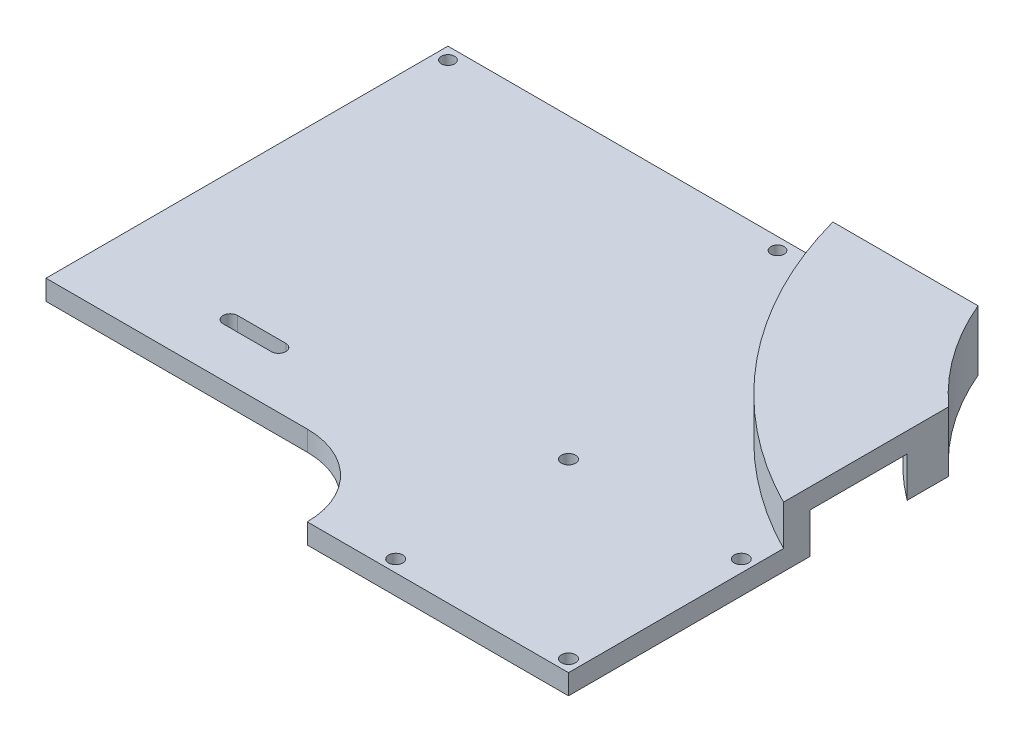
ISO-10303-21;
HEADER;
FILE_DESCRIPTION(('STEP AP214'),'2;1');
FILE_NAME('part.step','',(''),(''),'','','');
FILE_SCHEMA(('AUTOMOTIVE_DESIGN { 1 0 10303 214 1 1 1 1 }'));
ENDSEC;
DATA;
#1=APPLICATION_CONTEXT('core data for automotive mechanical design processes');
#2=APPLICATION_PROTOCOL_DEFINITION('international standard','automotive_design',2000,#1);
#3=PRODUCT_CONTEXT('',#1,'mechanical');
#4=PRODUCT('Part','Part','',(#3));
#5=PRODUCT_RELATED_PRODUCT_CATEGORY('part','',(#4));
#6=PRODUCT_DEFINITION_FORMATION('','',#4);
#7=PRODUCT_DEFINITION_CONTEXT('part definition',#1,'design');
#8=PRODUCT_DEFINITION('design','',#6,#7);
#9=PRODUCT_DEFINITION_SHAPE('','',#8);
#10=(LENGTH_UNIT() NAMED_UNIT(*) SI_UNIT(.MILLI.,.METRE.));
#11=(NAMED_UNIT(*) PLANE_ANGLE_UNIT() SI_UNIT($,.RADIAN.));
#12=(NAMED_UNIT(*) SI_UNIT($,.STERADIAN.) SOLID_ANGLE_UNIT());
#13=UNCERTAINTY_MEASURE_WITH_UNIT(LENGTH_MEASURE(1.E-05),#10,'distance_accuracy_value','');
#14=(GEOMETRIC_REPRESENTATION_CONTEXT(3) GLOBAL_UNCERTAINTY_ASSIGNED_CONTEXT((#13)) GLOBAL_UNIT_ASSIGNED_CONTEXT((#10,
#11,#12)) REPRESENTATION_CONTEXT('',''));
#15=CARTESIAN_POINT('',(0.,0.,0.));
#16=DIRECTION('',(0.,0.,1.));
#17=DIRECTION('',(1.,0.,0.));
#18=AXIS2_PLACEMENT_3D('',#15,#16,#17);
#19=CARTESIAN_POINT('',(0.,0.,0.));
#20=DIRECTION('',(0.,-1.,0.));
#21=DIRECTION('',(0.,0.,-1.));
#22=AXIS2_PLACEMENT_3D('',#19,#20,#21);
#23=PLANE('',#22);
#24=CARTESIAN_POINT('',(123.,0.,-88.));
#25=DIRECTION('',(0.,-1.,0.));
#26=DIRECTION('',(0.,0.,-1.));
#27=AXIS2_PLACEMENT_3D('',#24,#25,#26);
#28=CIRCLE('',#27,71.8);
#29=CARTESIAN_POINT('',(75.,0.,-34.6029963387458));
#30=VERTEX_POINT('',#29);
#31=CARTESIAN_POINT('',(56.8846462612504,0.,-60.));
#32=VERTEX_POINT('',#31);
#33=EDGE_CURVE('E198',#30,#32,#28,.T.);
#34=ORIENTED_EDGE('',*,*,#33,.F.);
#35=DIRECTION('',(0.,0.,-1.));
#36=VECTOR('',#35,1.);
#37=CARTESIAN_POINT('',(75.,0.,60.));
#38=LINE('',#37,#36);
#39=CARTESIAN_POINT('',(75.,0.,-24.2501764708325));
#40=VERTEX_POINT('',#39);
#41=EDGE_CURVE('E250',#40,#30,#38,.T.);
#42=ORIENTED_EDGE('',*,*,#41,.F.);
#43=CARTESIAN_POINT('',(123.,0.,-88.));
#44=DIRECTION('',(0.,-1.,0.));
#45=DIRECTION('',(0.,0.,1.));
#46=AXIS2_PLACEMENT_3D('',#43,#44,#45);
#47=CIRCLE('',#46,79.8);
#48=CARTESIAN_POINT('',(48.2735655875379,0.,-60.));
#49=VERTEX_POINT('',#48);
#50=EDGE_CURVE('E204',#40,#49,#47,.T.);
#51=ORIENTED_EDGE('',*,*,#50,.T.);
#52=DIRECTION('',(-1.,0.,0.));
#53=VECTOR('',#52,1.);
#54=CARTESIAN_POINT('',(-75.,0.,-60.));
#55=LINE('',#54,#53);
#56=EDGE_CURVE('E329',#32,#49,#55,.T.);
#57=ORIENTED_EDGE('',*,*,#56,.F.);
#58=EDGE_LOOP('',(#34,#42,#51,#57));
#59=FACE_BOUND('',#58,.T.);
#60=ADVANCED_FACE('F57',(#59),#23,.T.);
#61=CARTESIAN_POINT('',(75.,5.,60.));
#62=DIRECTION('',(-1.,0.,0.));
#63=DIRECTION('',(0.,0.,1.));
#64=AXIS2_PLACEMENT_3D('',#61,#62,#63);
#65=PLANE('',#64);
#66=ORIENTED_EDGE('',*,*,#41,.T.);
#67=DIRECTION('',(0.,-1.,0.));
#68=VECTOR('',#67,1.);
#69=CARTESIAN_POINT('',(75.,20.,-34.6029963387458));
#70=LINE('',#69,#68);
#71=CARTESIAN_POINT('',(75.,15.,-34.6029963387458));
#72=VERTEX_POINT('',#71);
#73=EDGE_CURVE('E201',#30,#72,#70,.F.);
#74=ORIENTED_EDGE('',*,*,#73,.T.);
#75=DIRECTION('',(0.,0.,-1.));
#76=VECTOR('',#75,1.);
#77=CARTESIAN_POINT('',(75.,15.,-60.));
#78=LINE('',#77,#76);
#79=CARTESIAN_POINT('',(75.,15.,6.50925880568526));
#80=VERTEX_POINT('',#79);
#81=EDGE_CURVE('E214',#80,#72,#78,.T.);
#82=ORIENTED_EDGE('',*,*,#81,.F.);
#83=DIRECTION('',(0.,-1.,0.));
#84=VECTOR('',#83,1.);
#85=CARTESIAN_POINT('',(75.,10.,6.50925880568526));
#86=LINE('',#85,#84);
#87=CARTESIAN_POINT('',(75.,5.,6.50925880568526));
#88=VERTEX_POINT('',#87);
#89=EDGE_CURVE('E233',#80,#88,#86,.T.);
#90=ORIENTED_EDGE('',*,*,#89,.T.);
#91=DIRECTION('',(0.,0.,-1.));
#92=VECTOR('',#91,1.);
#93=CARTESIAN_POINT('',(75.,5.,60.));
#94=LINE('',#93,#92);
#95=CARTESIAN_POINT('',(75.,5.,60.));
#96=VERTEX_POINT('',#95);
#97=EDGE_CURVE('E315',#96,#88,#94,.T.);
#98=ORIENTED_EDGE('',*,*,#97,.F.);
#99=DIRECTION('',(0.,-1.,0.));
#100=VECTOR('',#99,1.);
#101=CARTESIAN_POINT('',(75.,5.,60.));
#102=LINE('',#101,#100);
#103=CARTESIAN_POINT('',(75.,0.,60.));
#104=VERTEX_POINT('',#103);
#105=EDGE_CURVE('E324',#96,#104,#102,.T.);
#106=ORIENTED_EDGE('',*,*,#105,.T.);
#107=CARTESIAN_POINT('',(74.9999999999999,0.,-0.0452389008986226));
#108=VERTEX_POINT('',#107);
#109=EDGE_CURVE('E325',#104,#108,#38,.T.);
#110=ORIENTED_EDGE('',*,*,#109,.T.);
#111=DIRECTION('',(0.,-1.,0.));
#112=VECTOR('',#111,1.);
#113=CARTESIAN_POINT('',(75.,10.,-0.0452389008985948));
#114=LINE('',#113,#112);
#115=CARTESIAN_POINT('',(75.,10.,-0.0452389008985948));
#116=VERTEX_POINT('',#115);
#117=EDGE_CURVE('E231',#116,#108,#114,.T.);
#118=ORIENTED_EDGE('',*,*,#117,.F.);
#119=DIRECTION('',(0.,0.,-1.));
#120=VECTOR('',#119,1.);
#121=CARTESIAN_POINT('',(75.,10.,-60.));
#122=LINE('',#121,#120);
#123=CARTESIAN_POINT('',(75.,10.,-24.2501764708325));
#124=VERTEX_POINT('',#123);
#125=EDGE_CURVE('E210',#116,#124,#122,.T.);
#126=ORIENTED_EDGE('',*,*,#125,.T.);
#127=DIRECTION('',(0.,-1.,0.));
#128=VECTOR('',#127,1.);
#129=CARTESIAN_POINT('',(75.,10.,-24.2501764708325));
#130=LINE('',#129,#128);
#131=EDGE_CURVE('E241',#124,#40,#130,.T.);
#132=ORIENTED_EDGE('',*,*,#131,.T.);
#133=EDGE_LOOP('',(#66,#74,#82,#90,#98,#106,#110,#118,#126,#132));
#134=FACE_BOUND('',#133,.T.);
#135=ADVANCED_FACE('F59',(#134),#65,.F.);
#136=CARTESIAN_POINT('',(-75.,5.,-60.));
#137=DIRECTION('',(0.,0.,1.));
#138=DIRECTION('',(1.,0.,0.));
#139=AXIS2_PLACEMENT_3D('',#136,#137,#138);
#140=PLANE('',#139);
#141=DIRECTION('',(-1.,0.,0.));
#142=VECTOR('',#141,1.);
#143=CARTESIAN_POINT('',(20.7649766469436,15.,-60.));
#144=LINE('',#143,#142);
#145=CARTESIAN_POINT('',(56.8846462612504,15.,-60.));
#146=VERTEX_POINT('',#145);
#147=CARTESIAN_POINT('',(20.7649766469436,15.,-60.));
#148=VERTEX_POINT('',#147);
#149=EDGE_CURVE('E218',#146,#148,#144,.T.);
#150=ORIENTED_EDGE('',*,*,#149,.F.);
#151=DIRECTION('',(0.,-1.,0.));
#152=VECTOR('',#151,1.);
#153=CARTESIAN_POINT('',(56.8846462612504,20.,-60.));
#154=LINE('',#153,#152);
#155=EDGE_CURVE('E79',#146,#32,#154,.T.);
#156=ORIENTED_EDGE('',*,*,#155,.T.);
#157=ORIENTED_EDGE('',*,*,#56,.T.);
#158=DIRECTION('',(0.,-1.,0.));
#159=VECTOR('',#158,1.);
#160=CARTESIAN_POINT('',(48.2735655875379,10.,-60.));
#161=LINE('',#160,#159);
#162=CARTESIAN_POINT('',(48.2735655875379,10.,-60.));
#163=VERTEX_POINT('',#162);
#164=EDGE_CURVE('E243',#163,#49,#161,.T.);
#165=ORIENTED_EDGE('',*,*,#164,.F.);
#166=DIRECTION('',(-1.,0.,0.));
#167=VECTOR('',#166,1.);
#168=CARTESIAN_POINT('',(20.7649766469436,10.,-60.));
#169=LINE('',#168,#167);
#170=CARTESIAN_POINT('',(26.7916843510916,10.,-60.));
#171=VERTEX_POINT('',#170);
#172=EDGE_CURVE('E215',#163,#171,#169,.T.);
#173=ORIENTED_EDGE('',*,*,#172,.T.);
#174=DIRECTION('',(0.,-1.,0.));
#175=VECTOR('',#174,1.);
#176=CARTESIAN_POINT('',(26.7916843510916,10.,-60.));
#177=LINE('',#176,#175);
#178=CARTESIAN_POINT('',(26.7916843510916,0.,-60.));
#179=VERTEX_POINT('',#178);
#180=EDGE_CURVE('E228',#171,#179,#177,.T.);
#181=ORIENTED_EDGE('',*,*,#180,.T.);
#182=CARTESIAN_POINT('',(-75.,0.,-60.));
#183=VERTEX_POINT('',#182);
#184=EDGE_CURVE('E328',#179,#183,#55,.T.);
#185=ORIENTED_EDGE('',*,*,#184,.T.);
#186=DIRECTION('',(0.,-1.,0.));
#187=VECTOR('',#186,1.);
#188=CARTESIAN_POINT('',(-75.,5.,-60.));
#189=LINE('',#188,#187);
#190=CARTESIAN_POINT('',(-75.,5.,-60.));
#191=VERTEX_POINT('',#190);
#192=EDGE_CURVE('E337',#191,#183,#189,.T.);
#193=ORIENTED_EDGE('',*,*,#192,.F.);
#194=DIRECTION('',(-1.,0.,0.));
#195=VECTOR('',#194,1.);
#196=CARTESIAN_POINT('',(-75.,5.,-60.));
#197=LINE('',#196,#195);
#198=CARTESIAN_POINT('',(20.7649766469436,5.,-60.));
#199=VERTEX_POINT('',#198);
#200=EDGE_CURVE('E318',#199,#191,#197,.T.);
#201=ORIENTED_EDGE('',*,*,#200,.F.);
#202=DIRECTION('',(0.,-1.,0.));
#203=VECTOR('',#202,1.);
#204=CARTESIAN_POINT('',(20.7649766469436,10.,-60.));
#205=LINE('',#204,#203);
#206=EDGE_CURVE('E236',#148,#199,#205,.T.);
#207=ORIENTED_EDGE('',*,*,#206,.F.);
#208=EDGE_LOOP('',(#150,#156,#157,#165,#173,#181,#185,#193,#201,#207));
#209=FACE_BOUND('',#208,.T.);
#210=ADVANCED_FACE('F362',(#209),#140,.F.);
#211=CARTESIAN_POINT('',(-75.,5.,60.));
#212=DIRECTION('',(1.,0.,0.));
#213=DIRECTION('',(0.,0.,-1.));
#214=AXIS2_PLACEMENT_3D('',#211,#212,#213);
#215=PLANE('',#214);
#216=DIRECTION('',(0.,0.,1.));
#217=VECTOR('',#216,1.);
#218=CARTESIAN_POINT('',(-75.,0.,60.));
#219=LINE('',#218,#217);
#220=CARTESIAN_POINT('',(-75.,0.,40.));
#221=VERTEX_POINT('',#220);
#222=EDGE_CURVE('E331',#183,#221,#219,.T.);
#223=ORIENTED_EDGE('',*,*,#222,.T.);
#224=DIRECTION('',(0.,1.,0.));
#225=VECTOR('',#224,1.);
#226=CARTESIAN_POINT('',(-75.,-5.,40.));
#227=LINE('',#226,#225);
#228=CARTESIAN_POINT('',(-75.,5.,40.));
#229=VERTEX_POINT('',#228);
#230=EDGE_CURVE('E179',#221,#229,#227,.T.);
#231=ORIENTED_EDGE('',*,*,#230,.T.);
#232=DIRECTION('',(0.,0.,1.));
#233=VECTOR('',#232,1.);
#234=CARTESIAN_POINT('',(-75.,5.,60.));
#235=LINE('',#234,#233);
#236=EDGE_CURVE('E193',#191,#229,#235,.T.);
#237=ORIENTED_EDGE('',*,*,#236,.F.);
#238=ORIENTED_EDGE('',*,*,#192,.T.);
#239=EDGE_LOOP('',(#223,#231,#237,#238));
#240=FACE_BOUND('',#239,.T.);
#241=ADVANCED_FACE('F366',(#240),#215,.F.);
#242=CARTESIAN_POINT('',(-75.,5.,60.));
#243=DIRECTION('',(0.,0.,-1.));
#244=DIRECTION('',(-1.,0.,0.));
#245=AXIS2_PLACEMENT_3D('',#242,#243,#244);
#246=PLANE('',#245);
#247=DIRECTION('',(1.,0.,0.));
#248=VECTOR('',#247,1.);
#249=CARTESIAN_POINT('',(-75.,5.,60.));
#250=LINE('',#249,#248);
#251=CARTESIAN_POINT('',(10.,5.,60.));
#252=VERTEX_POINT('',#251);
#253=EDGE_CURVE('E322',#252,#96,#250,.T.);
#254=ORIENTED_EDGE('',*,*,#253,.F.);
#255=DIRECTION('',(0.,1.,0.));
#256=VECTOR('',#255,1.);
#257=CARTESIAN_POINT('',(10.,-5.,60.));
#258=LINE('',#257,#256);
#259=CARTESIAN_POINT('',(10.,0.,60.));
#260=VERTEX_POINT('',#259);
#261=EDGE_CURVE('E185',#252,#260,#258,.F.);
#262=ORIENTED_EDGE('',*,*,#261,.T.);
#263=DIRECTION('',(1.,0.,0.));
#264=VECTOR('',#263,1.);
#265=CARTESIAN_POINT('',(-75.,0.,60.));
#266=LINE('',#265,#264);
#267=EDGE_CURVE('E319',#260,#104,#266,.T.);
#268=ORIENTED_EDGE('',*,*,#267,.T.);
#269=ORIENTED_EDGE('',*,*,#105,.F.);
#270=EDGE_LOOP('',(#254,#262,#268,#269));
#271=FACE_BOUND('',#270,.T.);
#272=ADVANCED_FACE('F344',(#271),#246,.F.);
#273=CARTESIAN_POINT('',(0.,5.,0.));
#274=DIRECTION('',(0.,-1.,0.));
#275=DIRECTION('',(0.,0.,-1.));
#276=AXIS2_PLACEMENT_3D('',#273,#274,#275);
#277=PLANE('',#276);
#278=ORIENTED_EDGE('',*,*,#236,.T.);
#279=DIRECTION('',(-1.,0.,0.));
#280=VECTOR('',#279,1.);
#281=CARTESIAN_POINT('',(-75.,5.,40.));
#282=LINE('',#281,#280);
#283=CARTESIAN_POINT('',(-9.99999999999999,5.,40.));
#284=VERTEX_POINT('',#283);
#285=EDGE_CURVE('E175',#284,#229,#282,.T.);
#286=ORIENTED_EDGE('',*,*,#285,.F.);
#287=CARTESIAN_POINT('',(-9.99999999999999,5.,60.));
#288=DIRECTION('',(0.,1.,0.));
#289=DIRECTION('',(0.,0.,1.));
#290=AXIS2_PLACEMENT_3D('',#287,#288,#289);
#291=CIRCLE('',#290,20.);
#292=EDGE_CURVE('E182',#252,#284,#291,.T.);
#293=ORIENTED_EDGE('',*,*,#292,.F.);
#294=ORIENTED_EDGE('',*,*,#253,.T.);
#295=ORIENTED_EDGE('',*,*,#97,.T.);
#296=CARTESIAN_POINT('',(123.,5.,-88.));
#297=DIRECTION('',(0.,1.,0.));
#298=DIRECTION('',(0.,0.,1.));
#299=AXIS2_PLACEMENT_3D('',#296,#297,#298);
#300=CIRCLE('',#299,106.);
#301=EDGE_CURVE('E220',#199,#88,#300,.T.);
#302=ORIENTED_EDGE('',*,*,#301,.F.);
#303=ORIENTED_EDGE('',*,*,#200,.T.);
#304=EDGE_LOOP('',(#278,#286,#293,#294,#295,#302,#303));
#305=FACE_BOUND('',#304,.T.);
#306=CARTESIAN_POINT('',(-72.,5.,-57.));
#307=DIRECTION('',(0.,1.,0.));
#308=DIRECTION('',(0.,0.,1.));
#309=AXIS2_PLACEMENT_3D('',#306,#307,#308);
#310=CIRCLE('',#309,1.65);
#311=CARTESIAN_POINT('',(-72.,5.,-55.35));
#312=VERTEX_POINT('',#311);
#313=EDGE_CURVE('E251',#312,#312,#310,.T.);
#314=ORIENTED_EDGE('',*,*,#313,.F.);
#315=EDGE_LOOP('',(#314));
#316=FACE_BOUND('',#315,.T.);
#317=CARTESIAN_POINT('',(29.,5.,14.));
#318=DIRECTION('',(0.,1.,0.));
#319=DIRECTION('',(0.,0.,1.));
#320=AXIS2_PLACEMENT_3D('',#317,#318,#319);
#321=CIRCLE('',#320,1.75);
#322=CARTESIAN_POINT('',(29.,5.,15.75));
#323=VERTEX_POINT('',#322);
#324=EDGE_CURVE('E246',#323,#323,#321,.T.);
#325=ORIENTED_EDGE('',*,*,#324,.F.);
#326=EDGE_LOOP('',(#325));
#327=FACE_BOUND('',#326,.T.);
#328=CARTESIAN_POINT('',(72.,5.,14.));
#329=DIRECTION('',(0.,1.,0.));
#330=DIRECTION('',(0.,0.,1.));
#331=AXIS2_PLACEMENT_3D('',#328,#329,#330);
#332=CIRCLE('',#331,1.75);
#333=CARTESIAN_POINT('',(72.,5.,15.75));
#334=VERTEX_POINT('',#333);
#335=EDGE_CURVE('E259',#334,#334,#332,.T.);
#336=ORIENTED_EDGE('',*,*,#335,.F.);
#337=EDGE_LOOP('',(#336));
#338=FACE_BOUND('',#337,.T.);
#339=CARTESIAN_POINT('',(29.,5.,57.));
#340=DIRECTION('',(0.,1.,0.));
#341=DIRECTION('',(0.,0.,1.));
#342=AXIS2_PLACEMENT_3D('',#339,#340,#341);
#343=CIRCLE('',#342,1.75);
#344=CARTESIAN_POINT('',(29.,5.,58.75));
#345=VERTEX_POINT('',#344);
#346=EDGE_CURVE('E258',#345,#345,#343,.T.);
#347=ORIENTED_EDGE('',*,*,#346,.F.);
#348=EDGE_LOOP('',(#347));
#349=FACE_BOUND('',#348,.T.);
#350=CARTESIAN_POINT('',(72.,5.,57.));
#351=DIRECTION('',(0.,1.,0.));
#352=DIRECTION('',(0.,0.,1.));
#353=AXIS2_PLACEMENT_3D('',#350,#351,#352);
#354=CIRCLE('',#353,1.75);
#355=CARTESIAN_POINT('',(72.,5.,58.75));
#356=VERTEX_POINT('',#355);
#357=EDGE_CURVE('E307',#356,#356,#354,.T.);
#358=ORIENTED_EDGE('',*,*,#357,.F.);
#359=EDGE_LOOP('',(#358));
#360=FACE_BOUND('',#359,.T.);
#361=DIRECTION('',(1.,0.,0.));
#362=VECTOR('',#361,1.);
#363=CARTESIAN_POINT('',(-43.1383514073638,5.,27.8));
#364=LINE('',#363,#362);
#365=CARTESIAN_POINT('',(-43.1383514073638,5.,27.8));
#366=VERTEX_POINT('',#365);
#367=CARTESIAN_POINT('',(-31.1383514073638,5.,27.8));
#368=VERTEX_POINT('',#367);
#369=EDGE_CURVE('E289',#366,#368,#364,.T.);
#370=ORIENTED_EDGE('',*,*,#369,.F.);
#371=CARTESIAN_POINT('',(-43.1383514073638,5.,26.));
#372=DIRECTION('',(0.,1.,0.));
#373=DIRECTION('',(0.,0.,1.));
#374=AXIS2_PLACEMENT_3D('',#371,#372,#373);
#375=CIRCLE('',#374,1.8);
#376=CARTESIAN_POINT('',(-43.1383514073638,5.,24.2));
#377=VERTEX_POINT('',#376);
#378=EDGE_CURVE('E287',#377,#366,#375,.T.);
#379=ORIENTED_EDGE('',*,*,#378,.F.);
#380=DIRECTION('',(-1.,0.,0.));
#381=VECTOR('',#380,1.);
#382=CARTESIAN_POINT('',(-43.1383514073638,5.,24.2));
#383=LINE('',#382,#381);
#384=CARTESIAN_POINT('',(-31.1383514073638,5.,24.2));
#385=VERTEX_POINT('',#384);
#386=EDGE_CURVE('E277',#385,#377,#383,.T.);
#387=ORIENTED_EDGE('',*,*,#386,.F.);
#388=CARTESIAN_POINT('',(-31.1383514073638,5.,26.));
#389=DIRECTION('',(0.,1.,0.));
#390=DIRECTION('',(0.,0.,1.));
#391=AXIS2_PLACEMENT_3D('',#388,#389,#390);
#392=CIRCLE('',#391,1.8);
#393=EDGE_CURVE('E293',#368,#385,#392,.T.);
#394=ORIENTED_EDGE('',*,*,#393,.F.);
#395=EDGE_LOOP('',(#370,#379,#387,#394));
#396=FACE_BOUND('',#395,.T.);
#397=CARTESIAN_POINT('',(10.,5.,-57.));
#398=DIRECTION('',(0.,1.,0.));
#399=DIRECTION('',(0.,0.,1.));
#400=AXIS2_PLACEMENT_3D('',#397,#398,#399);
#401=CIRCLE('',#400,1.65);
#402=CARTESIAN_POINT('',(10.,5.,-55.35));
#403=VERTEX_POINT('',#402);
#404=EDGE_CURVE('E269',#403,#403,#401,.T.);
#405=ORIENTED_EDGE('',*,*,#404,.F.);
#406=EDGE_LOOP('',(#405));
#407=FACE_BOUND('',#406,.T.);
#408=ADVANCED_FACE('F190',(#305,#316,#327,#338,#349,#360,#396,#407),#277,.F.);
#409=DIRECTION('',(1.,0.,0.));
#410=VECTOR('',#409,1.);
#411=CARTESIAN_POINT('',(0.,0.,40.));
#412=LINE('',#411,#410);
#413=CARTESIAN_POINT('',(-9.99999999999999,0.,40.));
#414=VERTEX_POINT('',#413);
#415=EDGE_CURVE('E12',#221,#414,#412,.T.);
#416=ORIENTED_EDGE('',*,*,#415,.F.);
#417=ORIENTED_EDGE('',*,*,#222,.F.);
#418=ORIENTED_EDGE('',*,*,#184,.F.);
#419=CARTESIAN_POINT('',(123.,0.,-88.));
#420=DIRECTION('',(0.,1.,0.));
#421=DIRECTION('',(0.,0.,1.));
#422=AXIS2_PLACEMENT_3D('',#419,#420,#421);
#423=CIRCLE('',#422,100.2);
#424=EDGE_CURVE('E207',#179,#108,#423,.T.);
#425=ORIENTED_EDGE('',*,*,#424,.T.);
#426=ORIENTED_EDGE('',*,*,#109,.F.);
#427=ORIENTED_EDGE('',*,*,#267,.F.);
#428=CARTESIAN_POINT('',(-9.99999999999999,0.,60.));
#429=DIRECTION('',(0.,-1.,0.));
#430=DIRECTION('',(0.,0.,-1.));
#431=AXIS2_PLACEMENT_3D('',#428,#429,#430);
#432=CIRCLE('',#431,20.);
#433=EDGE_CURVE('E65',#414,#260,#432,.T.);
#434=ORIENTED_EDGE('',*,*,#433,.F.);
#435=EDGE_LOOP('',(#416,#417,#418,#425,#426,#427,#434));
#436=FACE_BOUND('',#435,.T.);
#437=CARTESIAN_POINT('',(-72.,0.,-57.));
#438=DIRECTION('',(0.,1.,0.));
#439=DIRECTION('',(0.,0.,1.));
#440=AXIS2_PLACEMENT_3D('',#437,#438,#439);
#441=CIRCLE('',#440,1.65);
#442=CARTESIAN_POINT('',(-72.,0.,-55.35));
#443=VERTEX_POINT('',#442);
#444=EDGE_CURVE('E247',#443,#443,#441,.T.);
#445=ORIENTED_EDGE('',*,*,#444,.T.);
#446=EDGE_LOOP('',(#445));
#447=FACE_BOUND('',#446,.T.);
#448=CARTESIAN_POINT('',(29.,0.,14.));
#449=DIRECTION('',(0.,1.,0.));
#450=DIRECTION('',(0.,0.,1.));
#451=AXIS2_PLACEMENT_3D('',#448,#449,#450);
#452=CIRCLE('',#451,1.75);
#453=CARTESIAN_POINT('',(29.,0.,15.75));
#454=VERTEX_POINT('',#453);
#455=EDGE_CURVE('E262',#454,#454,#452,.T.);
#456=ORIENTED_EDGE('',*,*,#455,.T.);
#457=EDGE_LOOP('',(#456));
#458=FACE_BOUND('',#457,.T.);
#459=CARTESIAN_POINT('',(72.,0.,14.));
#460=DIRECTION('',(0.,1.,0.));
#461=DIRECTION('',(0.,0.,1.));
#462=AXIS2_PLACEMENT_3D('',#459,#460,#461);
#463=CIRCLE('',#462,1.75);
#464=CARTESIAN_POINT('',(72.,0.,15.75));
#465=VERTEX_POINT('',#464);
#466=EDGE_CURVE('E255',#465,#465,#463,.T.);
#467=ORIENTED_EDGE('',*,*,#466,.T.);
#468=EDGE_LOOP('',(#467));
#469=FACE_BOUND('',#468,.T.);
#470=CARTESIAN_POINT('',(29.,0.,57.));
#471=DIRECTION('',(0.,1.,0.));
#472=DIRECTION('',(0.,0.,1.));
#473=AXIS2_PLACEMENT_3D('',#470,#471,#472);
#474=CIRCLE('',#473,1.75);
#475=CARTESIAN_POINT('',(29.,0.,58.75));
#476=VERTEX_POINT('',#475);
#477=EDGE_CURVE('E310',#476,#476,#474,.T.);
#478=ORIENTED_EDGE('',*,*,#477,.T.);
#479=EDGE_LOOP('',(#478));
#480=FACE_BOUND('',#479,.T.);
#481=CARTESIAN_POINT('',(72.,0.,57.));
#482=DIRECTION('',(0.,1.,0.));
#483=DIRECTION('',(0.,0.,1.));
#484=AXIS2_PLACEMENT_3D('',#481,#482,#483);
#485=CIRCLE('',#484,1.75);
#486=CARTESIAN_POINT('',(72.,0.,58.75));
#487=VERTEX_POINT('',#486);
#488=EDGE_CURVE('E290',#487,#487,#485,.T.);
#489=ORIENTED_EDGE('',*,*,#488,.T.);
#490=EDGE_LOOP('',(#489));
#491=FACE_BOUND('',#490,.T.);
#492=CARTESIAN_POINT('',(-43.1383514073638,0.,26.));
#493=DIRECTION('',(0.,1.,0.));
#494=DIRECTION('',(0.,0.,1.));
#495=AXIS2_PLACEMENT_3D('',#492,#493,#494);
#496=CIRCLE('',#495,1.8);
#497=CARTESIAN_POINT('',(-43.1383514073638,0.,24.2));
#498=VERTEX_POINT('',#497);
#499=CARTESIAN_POINT('',(-43.1383514073638,0.,27.8));
#500=VERTEX_POINT('',#499);
#501=EDGE_CURVE('E273',#498,#500,#496,.T.);
#502=ORIENTED_EDGE('',*,*,#501,.T.);
#503=DIRECTION('',(1.,0.,0.));
#504=VECTOR('',#503,1.);
#505=CARTESIAN_POINT('',(-43.1383514073638,0.,27.8));
#506=LINE('',#505,#504);
#507=CARTESIAN_POINT('',(-31.1383514073638,0.,27.8));
#508=VERTEX_POINT('',#507);
#509=EDGE_CURVE('E276',#500,#508,#506,.T.);
#510=ORIENTED_EDGE('',*,*,#509,.T.);
#511=CARTESIAN_POINT('',(-31.1383514073638,0.,26.));
#512=DIRECTION('',(0.,1.,0.));
#513=DIRECTION('',(0.,0.,1.));
#514=AXIS2_PLACEMENT_3D('',#511,#512,#513);
#515=CIRCLE('',#514,1.8);
#516=CARTESIAN_POINT('',(-31.1383514073638,0.,24.2));
#517=VERTEX_POINT('',#516);
#518=EDGE_CURVE('E280',#508,#517,#515,.T.);
#519=ORIENTED_EDGE('',*,*,#518,.T.);
#520=DIRECTION('',(-1.,0.,0.));
#521=VECTOR('',#520,1.);
#522=CARTESIAN_POINT('',(-43.1383514073638,0.,24.2));
#523=LINE('',#522,#521);
#524=EDGE_CURVE('E283',#517,#498,#523,.T.);
#525=ORIENTED_EDGE('',*,*,#524,.T.);
#526=EDGE_LOOP('',(#502,#510,#519,#525));
#527=FACE_BOUND('',#526,.T.);
#528=CARTESIAN_POINT('',(10.,0.,-57.));
#529=DIRECTION('',(0.,1.,0.));
#530=DIRECTION('',(0.,0.,1.));
#531=AXIS2_PLACEMENT_3D('',#528,#529,#530);
#532=CIRCLE('',#531,1.65);
#533=CARTESIAN_POINT('',(10.,0.,-55.35));
#534=VERTEX_POINT('',#533);
#535=EDGE_CURVE('E254',#534,#534,#532,.T.);
#536=ORIENTED_EDGE('',*,*,#535,.T.);
#537=EDGE_LOOP('',(#536));
#538=FACE_BOUND('',#537,.T.);
#539=ADVANCED_FACE('F347',(#436,#447,#458,#469,#480,#491,#527,#538),#23,.T.);
#540=CARTESIAN_POINT('',(10.,0.,-57.));
#541=DIRECTION('',(0.,1.,0.));
#542=DIRECTION('',(0.,0.,1.));
#543=AXIS2_PLACEMENT_3D('',#540,#541,#542);
#544=CYLINDRICAL_SURFACE('',#543,1.65);
#545=ORIENTED_EDGE('',*,*,#535,.F.);
#546=EDGE_LOOP('',(#545));
#547=FACE_BOUND('',#546,.T.);
#548=ORIENTED_EDGE('',*,*,#404,.T.);
#549=EDGE_LOOP('',(#548));
#550=FACE_BOUND('',#549,.T.);
#551=ADVANCED_FACE('F383',(#547,#550),#544,.F.);
#552=CARTESIAN_POINT('',(-43.1383514073638,0.,26.));
#553=DIRECTION('',(0.,1.,0.));
#554=DIRECTION('',(0.,0.,1.));
#555=AXIS2_PLACEMENT_3D('',#552,#553,#554);
#556=CYLINDRICAL_SURFACE('',#555,1.8);
#557=ORIENTED_EDGE('',*,*,#378,.T.);
#558=DIRECTION('',(0.,1.,0.));
#559=VECTOR('',#558,1.);
#560=CARTESIAN_POINT('',(-43.1383514073638,0.,27.8));
#561=LINE('',#560,#559);
#562=EDGE_CURVE('E286',#500,#366,#561,.T.);
#563=ORIENTED_EDGE('',*,*,#562,.F.);
#564=ORIENTED_EDGE('',*,*,#501,.F.);
#565=DIRECTION('',(0.,1.,0.));
#566=VECTOR('',#565,1.);
#567=CARTESIAN_POINT('',(-43.1383514073638,0.,24.2));
#568=LINE('',#567,#566);
#569=EDGE_CURVE('E272',#498,#377,#568,.T.);
#570=ORIENTED_EDGE('',*,*,#569,.T.);
#571=EDGE_LOOP('',(#557,#563,#564,#570));
#572=FACE_BOUND('',#571,.T.);
#573=ADVANCED_FACE('F388',(#572),#556,.F.);
#574=CARTESIAN_POINT('',(-43.1383514073638,0.,24.2));
#575=DIRECTION('',(0.,0.,-1.));
#576=DIRECTION('',(-1.,0.,0.));
#577=AXIS2_PLACEMENT_3D('',#574,#575,#576);
#578=PLANE('',#577);
#579=ORIENTED_EDGE('',*,*,#386,.T.);
#580=ORIENTED_EDGE('',*,*,#569,.F.);
#581=ORIENTED_EDGE('',*,*,#524,.F.);
#582=DIRECTION('',(0.,1.,0.));
#583=VECTOR('',#582,1.);
#584=CARTESIAN_POINT('',(-31.1383514073638,0.,24.2));
#585=LINE('',#584,#583);
#586=EDGE_CURVE('E299',#517,#385,#585,.T.);
#587=ORIENTED_EDGE('',*,*,#586,.T.);
#588=EDGE_LOOP('',(#579,#580,#581,#587));
#589=FACE_BOUND('',#588,.T.);
#590=ADVANCED_FACE('F406',(#589),#578,.F.);
#591=CARTESIAN_POINT('',(-31.1383514073638,0.,26.));
#592=DIRECTION('',(0.,1.,0.));
#593=DIRECTION('',(0.,0.,1.));
#594=AXIS2_PLACEMENT_3D('',#591,#592,#593);
#595=CYLINDRICAL_SURFACE('',#594,1.8);
#596=ORIENTED_EDGE('',*,*,#393,.T.);
#597=ORIENTED_EDGE('',*,*,#586,.F.);
#598=ORIENTED_EDGE('',*,*,#518,.F.);
#599=DIRECTION('',(0.,1.,0.));
#600=VECTOR('',#599,1.);
#601=CARTESIAN_POINT('',(-31.1383514073638,0.,27.8));
#602=LINE('',#601,#600);
#603=EDGE_CURVE('E301',#508,#368,#602,.T.);
#604=ORIENTED_EDGE('',*,*,#603,.T.);
#605=EDGE_LOOP('',(#596,#597,#598,#604));
#606=FACE_BOUND('',#605,.T.);
#607=ADVANCED_FACE('F410',(#606),#595,.F.);
#608=CARTESIAN_POINT('',(-43.1383514073638,0.,27.8));
#609=DIRECTION('',(0.,0.,1.));
#610=DIRECTION('',(1.,0.,0.));
#611=AXIS2_PLACEMENT_3D('',#608,#609,#610);
#612=PLANE('',#611);
#613=ORIENTED_EDGE('',*,*,#369,.T.);
#614=ORIENTED_EDGE('',*,*,#603,.F.);
#615=ORIENTED_EDGE('',*,*,#509,.F.);
#616=ORIENTED_EDGE('',*,*,#562,.T.);
#617=EDGE_LOOP('',(#613,#614,#615,#616));
#618=FACE_BOUND('',#617,.T.);
#619=ADVANCED_FACE('F402',(#618),#612,.F.);
#620=CARTESIAN_POINT('',(72.,0.,57.));
#621=DIRECTION('',(0.,1.,0.));
#622=DIRECTION('',(0.,0.,1.));
#623=AXIS2_PLACEMENT_3D('',#620,#621,#622);
#624=CYLINDRICAL_SURFACE('',#623,1.75);
#625=ORIENTED_EDGE('',*,*,#488,.F.);
#626=EDGE_LOOP('',(#625));
#627=FACE_BOUND('',#626,.T.);
#628=ORIENTED_EDGE('',*,*,#357,.T.);
#629=EDGE_LOOP('',(#628));
#630=FACE_BOUND('',#629,.T.);
#631=ADVANCED_FACE('F398',(#627,#630),#624,.F.);
#632=CARTESIAN_POINT('',(29.,0.,57.));
#633=DIRECTION('',(0.,1.,0.));
#634=DIRECTION('',(0.,0.,1.));
#635=AXIS2_PLACEMENT_3D('',#632,#633,#634);
#636=CYLINDRICAL_SURFACE('',#635,1.75);
#637=ORIENTED_EDGE('',*,*,#477,.F.);
#638=EDGE_LOOP('',(#637));
#639=FACE_BOUND('',#638,.T.);
#640=ORIENTED_EDGE('',*,*,#346,.T.);
#641=EDGE_LOOP('',(#640));
#642=FACE_BOUND('',#641,.T.);
#643=ADVANCED_FACE('F394',(#639,#642),#636,.F.);
#644=CARTESIAN_POINT('',(72.,0.,14.));
#645=DIRECTION('',(0.,1.,0.));
#646=DIRECTION('',(0.,0.,1.));
#647=AXIS2_PLACEMENT_3D('',#644,#645,#646);
#648=CYLINDRICAL_SURFACE('',#647,1.75);
#649=ORIENTED_EDGE('',*,*,#466,.F.);
#650=EDGE_LOOP('',(#649));
#651=FACE_BOUND('',#650,.T.);
#652=ORIENTED_EDGE('',*,*,#335,.T.);
#653=EDGE_LOOP('',(#652));
#654=FACE_BOUND('',#653,.T.);
#655=ADVANCED_FACE('F397',(#651,#654),#648,.F.);
#656=CARTESIAN_POINT('',(29.,0.,14.));
#657=DIRECTION('',(0.,1.,0.));
#658=DIRECTION('',(0.,0.,1.));
#659=AXIS2_PLACEMENT_3D('',#656,#657,#658);
#660=CYLINDRICAL_SURFACE('',#659,1.75);
#661=ORIENTED_EDGE('',*,*,#455,.F.);
#662=EDGE_LOOP('',(#661));
#663=FACE_BOUND('',#662,.T.);
#664=ORIENTED_EDGE('',*,*,#324,.T.);
#665=EDGE_LOOP('',(#664));
#666=FACE_BOUND('',#665,.T.);
#667=ADVANCED_FACE('F418',(#663,#666),#660,.F.);
#668=CARTESIAN_POINT('',(-72.,0.,-57.));
#669=DIRECTION('',(0.,1.,0.));
#670=DIRECTION('',(0.,0.,1.));
#671=AXIS2_PLACEMENT_3D('',#668,#669,#670);
#672=CYLINDRICAL_SURFACE('',#671,1.65);
#673=ORIENTED_EDGE('',*,*,#444,.F.);
#674=EDGE_LOOP('',(#673));
#675=FACE_BOUND('',#674,.T.);
#676=ORIENTED_EDGE('',*,*,#313,.T.);
#677=EDGE_LOOP('',(#676));
#678=FACE_BOUND('',#677,.T.);
#679=ADVANCED_FACE('F421',(#675,#678),#672,.F.);
#680=CARTESIAN_POINT('',(123.,10.,-88.));
#681=DIRECTION('',(0.,-1.,0.));
#682=DIRECTION('',(0.,0.,-1.));
#683=AXIS2_PLACEMENT_3D('',#680,#681,#682);
#684=CYLINDRICAL_SURFACE('',#683,79.8);
#685=ORIENTED_EDGE('',*,*,#164,.T.);
#686=ORIENTED_EDGE('',*,*,#50,.F.);
#687=ORIENTED_EDGE('',*,*,#131,.F.);
#688=CARTESIAN_POINT('',(123.,10.,-88.));
#689=DIRECTION('',(0.,1.,0.));
#690=DIRECTION('',(0.,0.,1.));
#691=AXIS2_PLACEMENT_3D('',#688,#689,#690);
#692=CIRCLE('',#691,79.8);
#693=EDGE_CURVE('E238',#163,#124,#692,.T.);
#694=ORIENTED_EDGE('',*,*,#693,.F.);
#695=EDGE_LOOP('',(#685,#686,#687,#694));
#696=FACE_BOUND('',#695,.T.);
#697=ADVANCED_FACE('F428',(#696),#684,.T.);
#698=CARTESIAN_POINT('',(123.,10.,-88.));
#699=DIRECTION('',(0.,-1.,0.));
#700=DIRECTION('',(0.,0.,-1.));
#701=AXIS2_PLACEMENT_3D('',#698,#699,#700);
#702=CYLINDRICAL_SURFACE('',#701,106.);
#703=ORIENTED_EDGE('',*,*,#301,.T.);
#704=ORIENTED_EDGE('',*,*,#89,.F.);
#705=CARTESIAN_POINT('',(123.,15.,-88.));
#706=DIRECTION('',(0.,1.,0.));
#707=DIRECTION('',(0.,0.,1.));
#708=AXIS2_PLACEMENT_3D('',#705,#706,#707);
#709=CIRCLE('',#708,106.);
#710=EDGE_CURVE('E211',#148,#80,#709,.T.);
#711=ORIENTED_EDGE('',*,*,#710,.F.);
#712=ORIENTED_EDGE('',*,*,#206,.T.);
#713=EDGE_LOOP('',(#703,#704,#711,#712));
#714=FACE_BOUND('',#713,.T.);
#715=ADVANCED_FACE('F432',(#714),#702,.T.);
#716=CARTESIAN_POINT('',(123.,10.,-88.));
#717=DIRECTION('',(0.,-1.,0.));
#718=DIRECTION('',(0.,0.,-1.));
#719=AXIS2_PLACEMENT_3D('',#716,#717,#718);
#720=CYLINDRICAL_SURFACE('',#719,100.2);
#721=ORIENTED_EDGE('',*,*,#117,.T.);
#722=ORIENTED_EDGE('',*,*,#424,.F.);
#723=ORIENTED_EDGE('',*,*,#180,.F.);
#724=CARTESIAN_POINT('',(123.,10.,-88.));
#725=DIRECTION('',(0.,1.,0.));
#726=DIRECTION('',(0.,0.,1.));
#727=AXIS2_PLACEMENT_3D('',#724,#725,#726);
#728=CIRCLE('',#727,100.2);
#729=EDGE_CURVE('E225',#171,#116,#728,.T.);
#730=ORIENTED_EDGE('',*,*,#729,.T.);
#731=EDGE_LOOP('',(#721,#722,#723,#730));
#732=FACE_BOUND('',#731,.T.);
#733=ADVANCED_FACE('F436',(#732),#720,.F.);
#734=CARTESIAN_POINT('',(123.,10.,-88.));
#735=DIRECTION('',(0.,1.,0.));
#736=DIRECTION('',(0.,0.,1.));
#737=AXIS2_PLACEMENT_3D('',#734,#735,#736);
#738=PLANE('',#737);
#739=ORIENTED_EDGE('',*,*,#172,.F.);
#740=ORIENTED_EDGE('',*,*,#693,.T.);
#741=ORIENTED_EDGE('',*,*,#125,.F.);
#742=ORIENTED_EDGE('',*,*,#729,.F.);
#743=EDGE_LOOP('',(#739,#740,#741,#742));
#744=FACE_BOUND('',#743,.T.);
#745=ADVANCED_FACE('F439',(#744),#738,.F.);
#746=CARTESIAN_POINT('',(123.,15.,-88.));
#747=DIRECTION('',(0.,1.,0.));
#748=DIRECTION('',(0.,0.,1.));
#749=AXIS2_PLACEMENT_3D('',#746,#747,#748);
#750=PLANE('',#749);
#751=CARTESIAN_POINT('',(123.,15.,-88.));
#752=DIRECTION('',(0.,1.,0.));
#753=DIRECTION('',(0.,0.,1.));
#754=AXIS2_PLACEMENT_3D('',#751,#752,#753);
#755=CIRCLE('',#754,71.8);
#756=EDGE_CURVE('E340',#146,#72,#755,.T.);
#757=ORIENTED_EDGE('',*,*,#756,.F.);
#758=ORIENTED_EDGE('',*,*,#149,.T.);
#759=ORIENTED_EDGE('',*,*,#710,.T.);
#760=ORIENTED_EDGE('',*,*,#81,.T.);
#761=EDGE_LOOP('',(#757,#758,#759,#760));
#762=FACE_BOUND('',#761,.T.);
#763=ADVANCED_FACE('F443',(#762),#750,.T.);
#764=CARTESIAN_POINT('',(123.,20.,-88.));
#765=DIRECTION('',(0.,-1.,0.));
#766=DIRECTION('',(0.,0.,-1.));
#767=AXIS2_PLACEMENT_3D('',#764,#765,#766);
#768=CYLINDRICAL_SURFACE('',#767,71.8);
#769=ORIENTED_EDGE('',*,*,#33,.T.);
#770=ORIENTED_EDGE('',*,*,#155,.F.);
#771=ORIENTED_EDGE('',*,*,#756,.T.);
#772=ORIENTED_EDGE('',*,*,#73,.F.);
#773=EDGE_LOOP('',(#769,#770,#771,#772));
#774=FACE_BOUND('',#773,.T.);
#775=ADVANCED_FACE('F447',(#774),#768,.F.);
#776=CARTESIAN_POINT('',(-9.99999999999999,-5.,60.));
#777=DIRECTION('',(0.,1.,0.));
#778=DIRECTION('',(0.,0.,1.));
#779=AXIS2_PLACEMENT_3D('',#776,#777,#778);
#780=CYLINDRICAL_SURFACE('',#779,20.);
#781=ORIENTED_EDGE('',*,*,#292,.T.);
#782=DIRECTION('',(0.,1.,0.));
#783=VECTOR('',#782,1.);
#784=CARTESIAN_POINT('',(-9.99999999999999,-5.,40.));
#785=LINE('',#784,#783);
#786=EDGE_CURVE('E72',#414,#284,#785,.T.);
#787=ORIENTED_EDGE('',*,*,#786,.F.);
#788=ORIENTED_EDGE('',*,*,#433,.T.);
#789=ORIENTED_EDGE('',*,*,#261,.F.);
#790=EDGE_LOOP('',(#781,#787,#788,#789));
#791=FACE_BOUND('',#790,.T.);
#792=ADVANCED_FACE('F183',(#791),#780,.F.);
#793=CARTESIAN_POINT('',(-75.,-5.,40.));
#794=DIRECTION('',(0.,0.,-1.));
#795=DIRECTION('',(-1.,0.,0.));
#796=AXIS2_PLACEMENT_3D('',#793,#794,#795);
#797=PLANE('',#796);
#798=ORIENTED_EDGE('',*,*,#415,.T.);
#799=ORIENTED_EDGE('',*,*,#786,.T.);
#800=ORIENTED_EDGE('',*,*,#285,.T.);
#801=ORIENTED_EDGE('',*,*,#230,.F.);
#802=EDGE_LOOP('',(#798,#799,#800,#801));
#803=FACE_BOUND('',#802,.T.);
#804=ADVANCED_FACE('F173',(#803),#797,.F.);
#805=CLOSED_SHELL('',(#60,#135,#210,#241,#272,#408,#539,#551,#573,#590,#607,#619,#631,#643,#655,
#667,#679,#697,#715,#733,#745,#763,#775,#792,#804));
#806=MANIFOLD_SOLID_BREP('B2',#805);
#807=ADVANCED_BREP_SHAPE_REPRESENTATION('',(#18,#806),#14);
#808=SHAPE_DEFINITION_REPRESENTATION(#9,#807);
ENDSEC;
END-ISO-10303-21;
